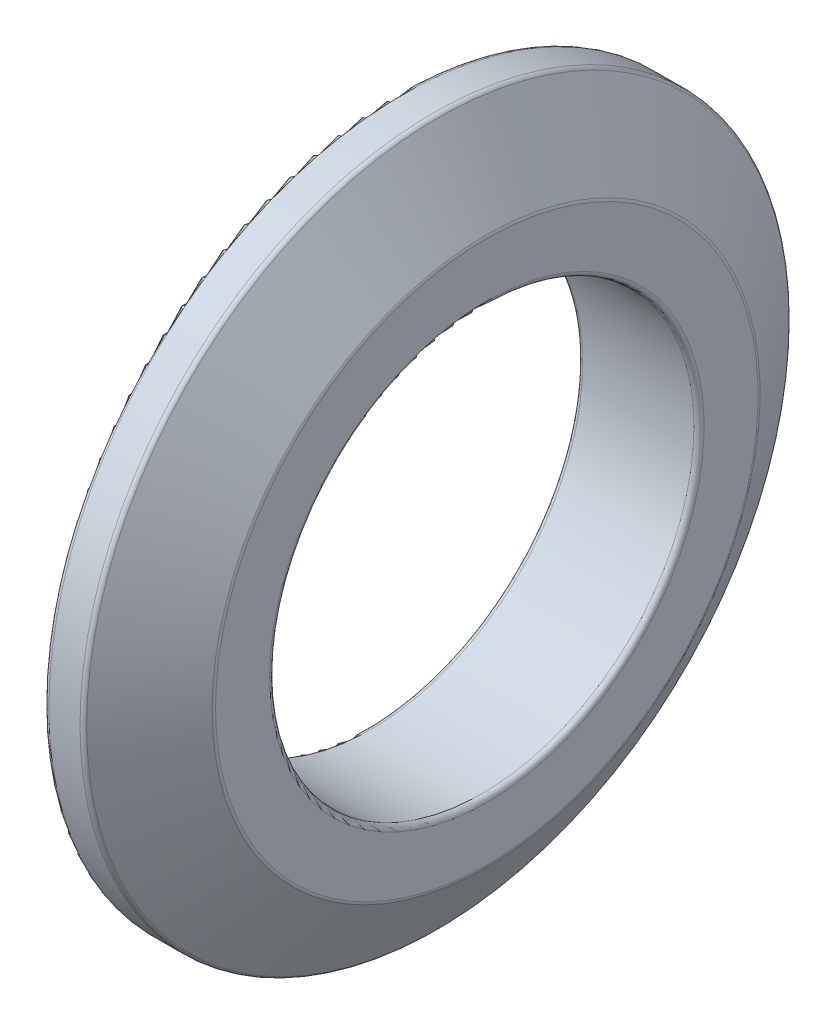
ISO-10303-21;
HEADER;
FILE_DESCRIPTION(('STEP AP214'),'2;1');
FILE_NAME('part.step','',(''),(''),'','','');
FILE_SCHEMA(('AUTOMOTIVE_DESIGN { 1 0 10303 214 1 1 1 1 }'));
ENDSEC;
DATA;
#1=APPLICATION_CONTEXT('core data for automotive mechanical design processes');
#2=APPLICATION_PROTOCOL_DEFINITION('international standard','automotive_design',2000,#1);
#3=PRODUCT_CONTEXT('',#1,'mechanical');
#4=PRODUCT('Part','Part','',(#3));
#5=PRODUCT_RELATED_PRODUCT_CATEGORY('part','',(#4));
#6=PRODUCT_DEFINITION_FORMATION('','',#4);
#7=PRODUCT_DEFINITION_CONTEXT('part definition',#1,'design');
#8=PRODUCT_DEFINITION('design','',#6,#7);
#9=PRODUCT_DEFINITION_SHAPE('','',#8);
#10=(LENGTH_UNIT() NAMED_UNIT(*) SI_UNIT(.MILLI.,.METRE.));
#11=(NAMED_UNIT(*) PLANE_ANGLE_UNIT() SI_UNIT($,.RADIAN.));
#12=(NAMED_UNIT(*) SI_UNIT($,.STERADIAN.) SOLID_ANGLE_UNIT());
#13=UNCERTAINTY_MEASURE_WITH_UNIT(LENGTH_MEASURE(1.E-05),#10,'distance_accuracy_value','');
#14=(GEOMETRIC_REPRESENTATION_CONTEXT(3) GLOBAL_UNCERTAINTY_ASSIGNED_CONTEXT((#13)) GLOBAL_UNIT_ASSIGNED_CONTEXT((#10,
#11,#12)) REPRESENTATION_CONTEXT('',''));
#15=CARTESIAN_POINT('',(0.,0.,0.));
#16=DIRECTION('',(0.,0.,1.));
#17=DIRECTION('',(1.,0.,0.));
#18=AXIS2_PLACEMENT_3D('',#15,#16,#17);
#19=CARTESIAN_POINT('',(0.25,0.,0.));
#20=DIRECTION('',(-1.,0.,0.));
#21=DIRECTION('',(0.,0.,1.));
#22=AXIS2_PLACEMENT_3D('',#19,#20,#21);
#23=TOROIDAL_SURFACE('',#22,11.5,0.25);
#24=CARTESIAN_POINT('',(0.,0.,0.));
#25=DIRECTION('',(-1.,0.,0.));
#26=DIRECTION('',(0.,0.,1.));
#27=AXIS2_PLACEMENT_3D('',#24,#25,#26);
#28=CIRCLE('',#27,11.5);
#29=CARTESIAN_POINT('',(0.,0.,11.5));
#30=VERTEX_POINT('',#29);
#31=EDGE_CURVE('E10',#30,#30,#28,.T.);
#32=ORIENTED_EDGE('',*,*,#31,.F.);
#33=EDGE_LOOP('',(#32));
#34=FACE_BOUND('',#33,.T.);
#35=CARTESIAN_POINT('',(0.250000000000002,0.,0.));
#36=DIRECTION('',(-1.,0.,0.));
#37=DIRECTION('',(0.,0.,1.));
#38=AXIS2_PLACEMENT_3D('',#35,#36,#37);
#39=CIRCLE('',#38,11.75);
#40=CARTESIAN_POINT('',(0.250000000000002,0.,11.75));
#41=VERTEX_POINT('',#40);
#42=EDGE_CURVE('E82',#41,#41,#39,.T.);
#43=ORIENTED_EDGE('',*,*,#42,.T.);
#44=EDGE_LOOP('',(#43));
#45=FACE_BOUND('',#44,.T.);
#46=ADVANCED_FACE('F39',(#34,#45),#23,.T.);
#47=CARTESIAN_POINT('',(0.,11.5,0.));
#48=DIRECTION('',(1.,0.,0.));
#49=DIRECTION('',(0.,0.,-1.));
#50=AXIS2_PLACEMENT_3D('',#47,#48,#49);
#51=PLANE('',#50);
#52=CARTESIAN_POINT('',(0.,0.,0.));
#53=DIRECTION('',(-1.,0.,0.));
#54=DIRECTION('',(0.,0.,1.));
#55=AXIS2_PLACEMENT_3D('',#52,#53,#54);
#56=CIRCLE('',#55,10.75);
#57=CARTESIAN_POINT('',(0.,0.,10.75));
#58=VERTEX_POINT('',#57);
#59=EDGE_CURVE('E44',#58,#58,#56,.T.);
#60=ORIENTED_EDGE('',*,*,#59,.F.);
#61=EDGE_LOOP('',(#60));
#62=FACE_BOUND('',#61,.T.);
#63=ORIENTED_EDGE('',*,*,#31,.T.);
#64=EDGE_LOOP('',(#63));
#65=FACE_BOUND('',#64,.T.);
#66=ADVANCED_FACE('F156',(#62,#65),#51,.F.);
#67=CARTESIAN_POINT('',(0.25,0.,0.));
#68=DIRECTION('',(-1.,0.,0.));
#69=DIRECTION('',(0.,0.,1.));
#70=AXIS2_PLACEMENT_3D('',#67,#68,#69);
#71=TOROIDAL_SURFACE('',#70,10.75,0.25);
#72=CARTESIAN_POINT('',(0.250000000000002,0.,0.));
#73=DIRECTION('',(-1.,0.,0.));
#74=DIRECTION('',(0.,0.,1.));
#75=AXIS2_PLACEMENT_3D('',#72,#73,#74);
#76=CIRCLE('',#75,10.5);
#77=CARTESIAN_POINT('',(0.250000000000002,0.,10.5));
#78=VERTEX_POINT('',#77);
#79=EDGE_CURVE('E47',#78,#78,#76,.T.);
#80=ORIENTED_EDGE('',*,*,#79,.F.);
#81=EDGE_LOOP('',(#80));
#82=FACE_BOUND('',#81,.T.);
#83=ORIENTED_EDGE('',*,*,#59,.T.);
#84=EDGE_LOOP('',(#83));
#85=FACE_BOUND('',#84,.T.);
#86=ADVANCED_FACE('F154',(#82,#85),#71,.T.);
#87=CARTESIAN_POINT('',(0.,0.,0.));
#88=DIRECTION('',(-1.,0.,0.));
#89=DIRECTION('',(0.,0.,1.));
#90=AXIS2_PLACEMENT_3D('',#87,#88,#89);
#91=CYLINDRICAL_SURFACE('',#90,10.5);
#92=CARTESIAN_POINT('',(5.75,0.,0.));
#93=DIRECTION('',(-1.,0.,0.));
#94=DIRECTION('',(0.,0.,1.));
#95=AXIS2_PLACEMENT_3D('',#92,#93,#94);
#96=CIRCLE('',#95,10.5);
#97=CARTESIAN_POINT('',(5.75,0.,10.5));
#98=VERTEX_POINT('',#97);
#99=EDGE_CURVE('E52',#98,#98,#96,.T.);
#100=ORIENTED_EDGE('',*,*,#99,.F.);
#101=EDGE_LOOP('',(#100));
#102=FACE_BOUND('',#101,.T.);
#103=ORIENTED_EDGE('',*,*,#79,.T.);
#104=EDGE_LOOP('',(#103));
#105=FACE_BOUND('',#104,.T.);
#106=ADVANCED_FACE('F150',(#102,#105),#91,.F.);
#107=CARTESIAN_POINT('',(5.75,0.,0.));
#108=DIRECTION('',(-1.,0.,0.));
#109=DIRECTION('',(0.,0.,1.));
#110=AXIS2_PLACEMENT_3D('',#107,#108,#109);
#111=TOROIDAL_SURFACE('',#110,10.75,0.25);
#112=CARTESIAN_POINT('',(6.,0.,0.));
#113=DIRECTION('',(-1.,0.,0.));
#114=DIRECTION('',(0.,0.,1.));
#115=AXIS2_PLACEMENT_3D('',#112,#113,#114);
#116=CIRCLE('',#115,10.75);
#117=CARTESIAN_POINT('',(6.,0.,10.75));
#118=VERTEX_POINT('',#117);
#119=EDGE_CURVE('E59',#118,#118,#116,.T.);
#120=ORIENTED_EDGE('',*,*,#119,.F.);
#121=EDGE_LOOP('',(#120));
#122=FACE_BOUND('',#121,.T.);
#123=ORIENTED_EDGE('',*,*,#99,.T.);
#124=EDGE_LOOP('',(#123));
#125=FACE_BOUND('',#124,.T.);
#126=ADVANCED_FACE('F141',(#122,#125),#111,.T.);
#127=CARTESIAN_POINT('',(6.,10.75,0.));
#128=DIRECTION('',(-1.,0.,0.));
#129=DIRECTION('',(0.,0.,1.));
#130=AXIS2_PLACEMENT_3D('',#127,#128,#129);
#131=PLANE('',#130);
#132=CARTESIAN_POINT('',(6.,0.,0.));
#133=DIRECTION('',(-1.,0.,0.));
#134=DIRECTION('',(0.,0.,1.));
#135=AXIS2_PLACEMENT_3D('',#132,#133,#134);
#136=CIRCLE('',#135,13.4283009433972);
#137=CARTESIAN_POINT('',(6.,0.,13.4283009433972));
#138=VERTEX_POINT('',#137);
#139=EDGE_CURVE('E61',#138,#138,#136,.T.);
#140=ORIENTED_EDGE('',*,*,#139,.F.);
#141=EDGE_LOOP('',(#140));
#142=FACE_BOUND('',#141,.T.);
#143=ORIENTED_EDGE('',*,*,#119,.T.);
#144=EDGE_LOOP('',(#143));
#145=FACE_BOUND('',#144,.T.);
#146=ADVANCED_FACE('F134',(#142,#145),#131,.F.);
#147=CARTESIAN_POINT('',(5.75,0.,0.));
#148=DIRECTION('',(-1.,0.,0.));
#149=DIRECTION('',(0.,0.,1.));
#150=AXIS2_PLACEMENT_3D('',#147,#148,#149);
#151=TOROIDAL_SURFACE('',#150,13.4283009433972,0.25);
#152=CARTESIAN_POINT('',(5.96199957600127,0.,0.));
#153=DIRECTION('',(-1.,0.,0.));
#154=DIRECTION('',(0.,0.,1.));
#155=AXIS2_PLACEMENT_3D('',#152,#153,#154);
#156=CIRCLE('',#155,13.560800678398);
#157=CARTESIAN_POINT('',(5.96199957600127,0.,13.560800678398));
#158=VERTEX_POINT('',#157);
#159=EDGE_CURVE('E63',#158,#158,#156,.T.);
#160=ORIENTED_EDGE('',*,*,#159,.F.);
#161=EDGE_LOOP('',(#160));
#162=FACE_BOUND('',#161,.T.);
#163=ORIENTED_EDGE('',*,*,#139,.T.);
#164=EDGE_LOOP('',(#163));
#165=FACE_BOUND('',#164,.T.);
#166=ADVANCED_FACE('F129',(#162,#165),#151,.T.);
#167=CARTESIAN_POINT('',(5.96199957600127,0.,0.));
#168=DIRECTION('',(-1.,0.,0.));
#169=DIRECTION('',(0.,0.,1.));
#170=AXIS2_PLACEMENT_3D('',#167,#168,#169);
#171=CONICAL_SURFACE('',#170,13.560800678398,1.01219701145133);
#172=CARTESIAN_POINT('',(3.5734376656245,0.,0.));
#173=DIRECTION('',(-1.,0.,0.));
#174=DIRECTION('',(0.,0.,1.));
#175=AXIS2_PLACEMENT_3D('',#172,#173,#174);
#176=CIRCLE('',#175,17.3824997350008);
#177=CARTESIAN_POINT('',(3.5734376656245,0.,17.3824997350008));
#178=VERTEX_POINT('',#177);
#179=EDGE_CURVE('E70',#178,#178,#176,.T.);
#180=ORIENTED_EDGE('',*,*,#179,.F.);
#181=EDGE_LOOP('',(#180));
#182=FACE_BOUND('',#181,.T.);
#183=ORIENTED_EDGE('',*,*,#159,.T.);
#184=EDGE_LOOP('',(#183));
#185=FACE_BOUND('',#184,.T.);
#186=ADVANCED_FACE('F121',(#182,#185),#171,.T.);
#187=CARTESIAN_POINT('',(3.36143808962323,0.,0.));
#188=DIRECTION('',(-1.,0.,0.));
#189=DIRECTION('',(0.,0.,1.));
#190=AXIS2_PLACEMENT_3D('',#187,#188,#189);
#191=TOROIDAL_SURFACE('',#190,17.25,0.25);
#192=CARTESIAN_POINT('',(3.36143808962323,0.,0.));
#193=DIRECTION('',(-1.,0.,0.));
#194=DIRECTION('',(0.,0.,1.));
#195=AXIS2_PLACEMENT_3D('',#192,#193,#194);
#196=CIRCLE('',#195,17.5);
#197=CARTESIAN_POINT('',(3.36143808962323,0.,17.5));
#198=VERTEX_POINT('',#197);
#199=EDGE_CURVE('E68',#198,#198,#196,.T.);
#200=ORIENTED_EDGE('',*,*,#199,.F.);
#201=EDGE_LOOP('',(#200));
#202=FACE_BOUND('',#201,.T.);
#203=ORIENTED_EDGE('',*,*,#179,.T.);
#204=EDGE_LOOP('',(#203));
#205=FACE_BOUND('',#204,.T.);
#206=ADVANCED_FACE('F117',(#202,#205),#191,.T.);
#207=CARTESIAN_POINT('',(0.,0.,0.));
#208=DIRECTION('',(-1.,0.,0.));
#209=DIRECTION('',(0.,0.,1.));
#210=AXIS2_PLACEMENT_3D('',#207,#208,#209);
#211=CYLINDRICAL_SURFACE('',#210,17.5);
#212=CARTESIAN_POINT('',(1.82358400704358,0.,0.));
#213=DIRECTION('',(-1.,0.,0.));
#214=DIRECTION('',(0.,0.,1.));
#215=AXIS2_PLACEMENT_3D('',#212,#213,#214);
#216=CIRCLE('',#215,17.5);
#217=CARTESIAN_POINT('',(1.82358400704358,0.,17.5));
#218=VERTEX_POINT('',#217);
#219=EDGE_CURVE('E74',#218,#218,#216,.T.);
#220=ORIENTED_EDGE('',*,*,#219,.F.);
#221=EDGE_LOOP('',(#220));
#222=FACE_BOUND('',#221,.T.);
#223=ORIENTED_EDGE('',*,*,#199,.T.);
#224=EDGE_LOOP('',(#223));
#225=FACE_BOUND('',#224,.T.);
#226=ADVANCED_FACE('F112',(#222,#225),#211,.T.);
#227=CARTESIAN_POINT('',(1.82358400704358,0.,0.));
#228=DIRECTION('',(-1.,0.,0.));
#229=DIRECTION('',(0.,0.,1.));
#230=AXIS2_PLACEMENT_3D('',#227,#228,#229);
#231=TOROIDAL_SURFACE('',#230,17.25,0.25);
#232=CARTESIAN_POINT('',(1.58167968894437,0.,0.));
#233=DIRECTION('',(-1.,0.,0.));
#234=DIRECTION('',(0.,0.,1.));
#235=AXIS2_PLACEMENT_3D('',#232,#233,#234);
#236=CIRCLE('',#235,17.1868945257132);
#237=CARTESIAN_POINT('',(1.58167968894437,0.,17.1868945257132));
#238=VERTEX_POINT('',#237);
#239=EDGE_CURVE('E78',#238,#238,#236,.T.);
#240=ORIENTED_EDGE('',*,*,#239,.F.);
#241=EDGE_LOOP('',(#240));
#242=FACE_BOUND('',#241,.T.);
#243=ORIENTED_EDGE('',*,*,#219,.T.);
#244=EDGE_LOOP('',(#243));
#245=FACE_BOUND('',#244,.T.);
#246=ADVANCED_FACE('F103',(#242,#245),#231,.T.);
#247=CARTESIAN_POINT('',(1.58167968894437,0.,0.));
#248=DIRECTION('',(-1.,0.,0.));
#249=DIRECTION('',(0.,0.,1.));
#250=AXIS2_PLACEMENT_3D('',#247,#248,#249);
#251=CONICAL_SURFACE('',#250,17.1868945257132,1.31561393617408);
#252=CARTESIAN_POINT('',(2.91832031105563,0.,0.));
#253=DIRECTION('',(-1.,0.,0.));
#254=DIRECTION('',(0.,0.,1.));
#255=AXIS2_PLACEMENT_3D('',#252,#253,#254);
#256=CIRCLE('',#255,12.0631054742868);
#257=CARTESIAN_POINT('',(2.91832031105563,0.,12.0631054742868));
#258=VERTEX_POINT('',#257);
#259=EDGE_CURVE('E80',#258,#258,#256,.T.);
#260=ORIENTED_EDGE('',*,*,#259,.F.);
#261=EDGE_LOOP('',(#260));
#262=FACE_BOUND('',#261,.T.);
#263=ORIENTED_EDGE('',*,*,#239,.T.);
#264=EDGE_LOOP('',(#263));
#265=FACE_BOUND('',#264,.T.);
#266=ADVANCED_FACE('F98',(#262,#265),#251,.F.);
#267=CARTESIAN_POINT('',(2.67641599295642,0.,0.));
#268=DIRECTION('',(-1.,0.,0.));
#269=DIRECTION('',(0.,0.,1.));
#270=AXIS2_PLACEMENT_3D('',#267,#268,#269);
#271=TOROIDAL_SURFACE('',#270,12.,0.25);
#272=CARTESIAN_POINT('',(2.67641599295642,0.,0.));
#273=DIRECTION('',(-1.,0.,0.));
#274=DIRECTION('',(0.,0.,1.));
#275=AXIS2_PLACEMENT_3D('',#272,#273,#274);
#276=CIRCLE('',#275,11.75);
#277=CARTESIAN_POINT('',(2.67641599295642,0.,11.75));
#278=VERTEX_POINT('',#277);
#279=EDGE_CURVE('E85',#278,#278,#276,.T.);
#280=ORIENTED_EDGE('',*,*,#279,.F.);
#281=EDGE_LOOP('',(#280));
#282=FACE_BOUND('',#281,.T.);
#283=ORIENTED_EDGE('',*,*,#259,.T.);
#284=EDGE_LOOP('',(#283));
#285=FACE_BOUND('',#284,.T.);
#286=ADVANCED_FACE('F93',(#282,#285),#271,.F.);
#287=CARTESIAN_POINT('',(0.,0.,0.));
#288=DIRECTION('',(-1.,0.,0.));
#289=DIRECTION('',(0.,0.,1.));
#290=AXIS2_PLACEMENT_3D('',#287,#288,#289);
#291=CYLINDRICAL_SURFACE('',#290,11.75);
#292=ORIENTED_EDGE('',*,*,#42,.F.);
#293=EDGE_LOOP('',(#292));
#294=FACE_BOUND('',#293,.T.);
#295=ORIENTED_EDGE('',*,*,#279,.T.);
#296=EDGE_LOOP('',(#295));
#297=FACE_BOUND('',#296,.T.);
#298=ADVANCED_FACE('F89',(#294,#297),#291,.T.);
#299=CLOSED_SHELL('',(#46,#66,#86,#106,#126,#146,#166,#186,#206,#226,#246,#266,#286,#298));
#300=MANIFOLD_SOLID_BREP('B2',#299);
#301=ADVANCED_BREP_SHAPE_REPRESENTATION('',(#18,#300),#14);
#302=SHAPE_DEFINITION_REPRESENTATION(#9,#301);
ENDSEC;
END-ISO-10303-21;
